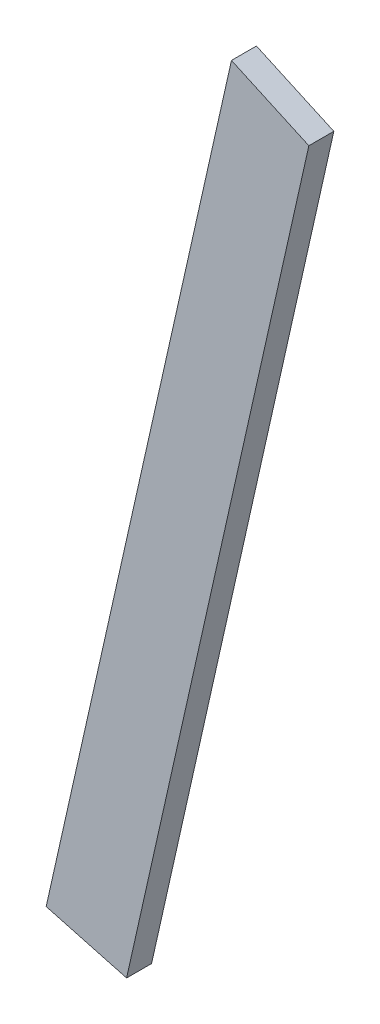
ISO-10303-21;
HEADER;
FILE_DESCRIPTION(('STEP AP214'),'2;1');
FILE_NAME('part.step','',(''),(''),'','','');
FILE_SCHEMA(('AUTOMOTIVE_DESIGN { 1 0 10303 214 1 1 1 1 }'));
ENDSEC;
DATA;
#1=APPLICATION_CONTEXT('core data for automotive mechanical design processes');
#2=APPLICATION_PROTOCOL_DEFINITION('international standard','automotive_design',2000,#1);
#3=PRODUCT_CONTEXT('',#1,'mechanical');
#4=PRODUCT('Part','Part','',(#3));
#5=PRODUCT_RELATED_PRODUCT_CATEGORY('part','',(#4));
#6=PRODUCT_DEFINITION_FORMATION('','',#4);
#7=PRODUCT_DEFINITION_CONTEXT('part definition',#1,'design');
#8=PRODUCT_DEFINITION('design','',#6,#7);
#9=PRODUCT_DEFINITION_SHAPE('','',#8);
#10=(LENGTH_UNIT() NAMED_UNIT(*) SI_UNIT(.MILLI.,.METRE.));
#11=(NAMED_UNIT(*) PLANE_ANGLE_UNIT() SI_UNIT($,.RADIAN.));
#12=(NAMED_UNIT(*) SI_UNIT($,.STERADIAN.) SOLID_ANGLE_UNIT());
#13=UNCERTAINTY_MEASURE_WITH_UNIT(LENGTH_MEASURE(1.E-05),#10,'distance_accuracy_value','');
#14=(GEOMETRIC_REPRESENTATION_CONTEXT(3) GLOBAL_UNCERTAINTY_ASSIGNED_CONTEXT((#13)) GLOBAL_UNIT_ASSIGNED_CONTEXT((#10,
#11,#12)) REPRESENTATION_CONTEXT('',''));
#15=CARTESIAN_POINT('',(0.,0.,0.));
#16=DIRECTION('',(0.,0.,1.));
#17=DIRECTION('',(1.,0.,0.));
#18=AXIS2_PLACEMENT_3D('',#15,#16,#17);
#19=CARTESIAN_POINT('',(-537.811094831005,1581.39112052883,19.05));
#20=DIRECTION('',(-0.97571625209357,0.21903834230672,0.));
#21=DIRECTION('',(-0.21903834230672,-0.975716252093571,0.));
#22=AXIS2_PLACEMENT_3D('',#19,#20,#21);
#23=PLANE('',#22);
#24=DIRECTION('',(0.21903834230672,0.975716252093571,0.));
#25=VECTOR('',#24,1.);
#26=CARTESIAN_POINT('',(-537.811094831005,1581.39112052883,0.));
#27=LINE('',#26,#25);
#28=CARTESIAN_POINT('',(-676.886193392129,961.874772392915,0.));
#29=VERTEX_POINT('',#28);
#30=CARTESIAN_POINT('',(-537.811094831005,1581.39112052883,0.));
#31=VERTEX_POINT('',#30);
#32=EDGE_CURVE('E95',#29,#31,#27,.T.);
#33=ORIENTED_EDGE('',*,*,#32,.T.);
#34=DIRECTION('',(0.,0.,-1.));
#35=VECTOR('',#34,1.);
#36=CARTESIAN_POINT('',(-537.811094831005,1581.39112052883,19.05));
#37=LINE('',#36,#35);
#38=CARTESIAN_POINT('',(-537.811094831005,1581.39112052883,19.05));
#39=VERTEX_POINT('',#38);
#40=EDGE_CURVE('E11',#39,#31,#37,.T.);
#41=ORIENTED_EDGE('',*,*,#40,.F.);
#42=DIRECTION('',(0.21903834230672,0.975716252093571,0.));
#43=VECTOR('',#42,1.);
#44=CARTESIAN_POINT('',(-537.811094831005,1581.39112052883,19.05));
#45=LINE('',#44,#43);
#46=CARTESIAN_POINT('',(-676.886193392129,961.874772392915,19.05));
#47=VERTEX_POINT('',#46);
#48=EDGE_CURVE('E83',#47,#39,#45,.T.);
#49=ORIENTED_EDGE('',*,*,#48,.F.);
#50=DIRECTION('',(0.,0.,-1.));
#51=VECTOR('',#50,1.);
#52=CARTESIAN_POINT('',(-676.886193392129,961.874772392915,19.05));
#53=LINE('',#52,#51);
#54=EDGE_CURVE('E91',#47,#29,#53,.T.);
#55=ORIENTED_EDGE('',*,*,#54,.T.);
#56=EDGE_LOOP('',(#33,#41,#49,#55));
#57=FACE_BOUND('',#56,.T.);
#58=ADVANCED_FACE('F32',(#57),#23,.F.);
#59=CARTESIAN_POINT('',(-596.865528173419,1608.23404477539,19.05));
#60=DIRECTION('',(-0.413802944301183,-0.910366477462605,0.));
#61=DIRECTION('',(0.910366477462605,-0.413802944301183,0.));
#62=AXIS2_PLACEMENT_3D('',#59,#60,#61);
#63=PLANE('',#62);
#64=DIRECTION('',(-0.910366477462605,0.413802944301183,0.));
#65=VECTOR('',#64,1.);
#66=CARTESIAN_POINT('',(-596.865528173419,1608.23404477539,0.));
#67=LINE('',#66,#65);
#68=CARTESIAN_POINT('',(-596.865528173419,1608.23404477539,0.));
#69=VERTEX_POINT('',#68);
#70=EDGE_CURVE('E87',#31,#69,#67,.T.);
#71=ORIENTED_EDGE('',*,*,#70,.T.);
#72=DIRECTION('',(0.,0.,-1.));
#73=VECTOR('',#72,1.);
#74=CARTESIAN_POINT('',(-596.865528173419,1608.23404477539,19.05));
#75=LINE('',#74,#73);
#76=CARTESIAN_POINT('',(-596.865528173419,1608.23404477539,19.05));
#77=VERTEX_POINT('',#76);
#78=EDGE_CURVE('E40',#77,#69,#75,.T.);
#79=ORIENTED_EDGE('',*,*,#78,.F.);
#80=DIRECTION('',(-0.910366477462605,0.413802944301183,0.));
#81=VECTOR('',#80,1.);
#82=CARTESIAN_POINT('',(-596.865528173419,1608.23404477539,19.05));
#83=LINE('',#82,#81);
#84=EDGE_CURVE('E78',#39,#77,#83,.T.);
#85=ORIENTED_EDGE('',*,*,#84,.F.);
#86=ORIENTED_EDGE('',*,*,#40,.T.);
#87=EDGE_LOOP('',(#71,#79,#85,#86));
#88=FACE_BOUND('',#87,.T.);
#89=ADVANCED_FACE('F86',(#88),#63,.F.);
#90=CARTESIAN_POINT('',(-596.865528173419,1608.23404477539,19.05));
#91=DIRECTION('',(0.97571625209357,-0.21903834230672,0.));
#92=DIRECTION('',(0.21903834230672,0.97571625209357,0.));
#93=AXIS2_PLACEMENT_3D('',#90,#91,#92);
#94=PLANE('',#93);
#95=DIRECTION('',(-0.21903834230672,-0.97571625209357,0.));
#96=VECTOR('',#95,1.);
#97=CARTESIAN_POINT('',(-596.865528173419,1608.23404477539,0.));
#98=LINE('',#97,#96);
#99=CARTESIAN_POINT('',(-738.251729963728,978.42278225492,0.));
#100=VERTEX_POINT('',#99);
#101=EDGE_CURVE('E65',#69,#100,#98,.T.);
#102=ORIENTED_EDGE('',*,*,#101,.T.);
#103=DIRECTION('',(0.,0.,-1.));
#104=VECTOR('',#103,1.);
#105=CARTESIAN_POINT('',(-738.251729963728,978.42278225492,19.05));
#106=LINE('',#105,#104);
#107=CARTESIAN_POINT('',(-738.251729963728,978.42278225492,19.05));
#108=VERTEX_POINT('',#107);
#109=EDGE_CURVE('E88',#108,#100,#106,.T.);
#110=ORIENTED_EDGE('',*,*,#109,.F.);
#111=DIRECTION('',(-0.21903834230672,-0.97571625209357,0.));
#112=VECTOR('',#111,1.);
#113=CARTESIAN_POINT('',(-596.865528173419,1608.23404477539,19.05));
#114=LINE('',#113,#112);
#115=EDGE_CURVE('E81',#77,#108,#114,.T.);
#116=ORIENTED_EDGE('',*,*,#115,.F.);
#117=ORIENTED_EDGE('',*,*,#78,.T.);
#118=EDGE_LOOP('',(#102,#110,#116,#117));
#119=FACE_BOUND('',#118,.T.);
#120=ADVANCED_FACE('F89',(#119),#94,.F.);
#121=CARTESIAN_POINT('',(-738.251729963728,978.42278225492,19.05));
#122=DIRECTION('',(0.260362499760676,0.965510936612513,0.));
#123=DIRECTION('',(-0.965510936612513,0.260362499760676,0.));
#124=AXIS2_PLACEMENT_3D('',#121,#122,#123);
#125=PLANE('',#124);
#126=DIRECTION('',(0.965510936612513,-0.260362499760676,0.));
#127=VECTOR('',#126,1.);
#128=CARTESIAN_POINT('',(-738.251729963728,978.42278225492,0.));
#129=LINE('',#128,#127);
#130=EDGE_CURVE('E71',#100,#29,#129,.T.);
#131=ORIENTED_EDGE('',*,*,#130,.T.);
#132=ORIENTED_EDGE('',*,*,#54,.F.);
#133=DIRECTION('',(0.965510936612513,-0.260362499760676,0.));
#134=VECTOR('',#133,1.);
#135=CARTESIAN_POINT('',(-738.251729963728,978.42278225492,19.05));
#136=LINE('',#135,#134);
#137=EDGE_CURVE('E48',#108,#47,#136,.T.);
#138=ORIENTED_EDGE('',*,*,#137,.F.);
#139=ORIENTED_EDGE('',*,*,#109,.T.);
#140=EDGE_LOOP('',(#131,#132,#138,#139));
#141=FACE_BOUND('',#140,.T.);
#142=ADVANCED_FACE('F102',(#141),#125,.F.);
#143=CARTESIAN_POINT('',(0.,0.,19.05));
#144=DIRECTION('',(0.,0.,1.));
#145=DIRECTION('',(1.,0.,0.));
#146=AXIS2_PLACEMENT_3D('',#143,#144,#145);
#147=PLANE('',#146);
#148=ORIENTED_EDGE('',*,*,#48,.T.);
#149=ORIENTED_EDGE('',*,*,#84,.T.);
#150=ORIENTED_EDGE('',*,*,#115,.T.);
#151=ORIENTED_EDGE('',*,*,#137,.T.);
#152=EDGE_LOOP('',(#148,#149,#150,#151));
#153=FACE_BOUND('',#152,.T.);
#154=ADVANCED_FACE('F79',(#153),#147,.T.);
#155=CARTESIAN_POINT('',(0.,0.,0.));
#156=DIRECTION('',(0.,0.,1.));
#157=DIRECTION('',(1.,0.,0.));
#158=AXIS2_PLACEMENT_3D('',#155,#156,#157);
#159=PLANE('',#158);
#160=ORIENTED_EDGE('',*,*,#32,.F.);
#161=ORIENTED_EDGE('',*,*,#130,.F.);
#162=ORIENTED_EDGE('',*,*,#101,.F.);
#163=ORIENTED_EDGE('',*,*,#70,.F.);
#164=EDGE_LOOP('',(#160,#161,#162,#163));
#165=FACE_BOUND('',#164,.T.);
#166=ADVANCED_FACE('F105',(#165),#159,.F.);
#167=CLOSED_SHELL('',(#58,#89,#120,#142,#154,#166));
#168=MANIFOLD_SOLID_BREP('B2',#167);
#169=ADVANCED_BREP_SHAPE_REPRESENTATION('',(#18,#168),#14);
#170=SHAPE_DEFINITION_REPRESENTATION(#9,#169);
ENDSEC;
END-ISO-10303-21;
